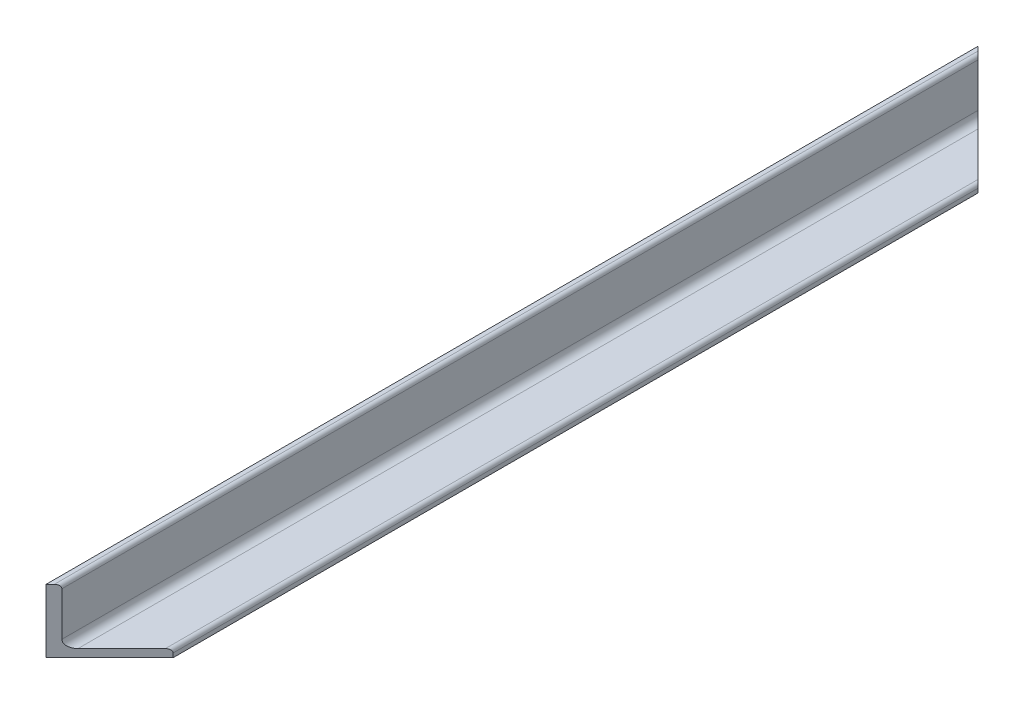
ISO-10303-21;
HEADER;
FILE_DESCRIPTION(('STEP AP214'),'2;1');
FILE_NAME('part.step','',(''),(''),'','','');
FILE_SCHEMA(('AUTOMOTIVE_DESIGN { 1 0 10303 214 1 1 1 1 }'));
ENDSEC;
DATA;
#1=APPLICATION_CONTEXT('core data for automotive mechanical design processes');
#2=APPLICATION_PROTOCOL_DEFINITION('international standard','automotive_design',2000,#1);
#3=PRODUCT_CONTEXT('',#1,'mechanical');
#4=PRODUCT('Part','Part','',(#3));
#5=PRODUCT_RELATED_PRODUCT_CATEGORY('part','',(#4));
#6=PRODUCT_DEFINITION_FORMATION('','',#4);
#7=PRODUCT_DEFINITION_CONTEXT('part definition',#1,'design');
#8=PRODUCT_DEFINITION('design','',#6,#7);
#9=PRODUCT_DEFINITION_SHAPE('','',#8);
#10=(LENGTH_UNIT() NAMED_UNIT(*) SI_UNIT(.MILLI.,.METRE.));
#11=(NAMED_UNIT(*) PLANE_ANGLE_UNIT() SI_UNIT($,.RADIAN.));
#12=(NAMED_UNIT(*) SI_UNIT($,.STERADIAN.) SOLID_ANGLE_UNIT());
#13=UNCERTAINTY_MEASURE_WITH_UNIT(LENGTH_MEASURE(1.E-05),#10,'distance_accuracy_value','');
#14=(GEOMETRIC_REPRESENTATION_CONTEXT(3) GLOBAL_UNCERTAINTY_ASSIGNED_CONTEXT((#13)) GLOBAL_UNIT_ASSIGNED_CONTEXT((#10,
#11,#12)) REPRESENTATION_CONTEXT('',''));
#15=CARTESIAN_POINT('',(0.,0.,0.));
#16=DIRECTION('',(0.,0.,1.));
#17=DIRECTION('',(1.,0.,0.));
#18=AXIS2_PLACEMENT_3D('',#15,#16,#17);
#19=CARTESIAN_POINT('',(279.39999995,0.,279.39999995));
#20=DIRECTION('',(-0.707106781186547,0.,-0.707106781186548));
#21=DIRECTION('',(-0.707106781186548,0.,0.707106781186547));
#22=AXIS2_PLACEMENT_3D('',#19,#20,#21);
#23=PLANE('',#22);
#24=DIRECTION('',(-0.707106781186547,0.,0.707106781186548));
#25=VECTOR('',#24,1.);
#26=CARTESIAN_POINT('',(38.1,0.,520.6999999));
#27=LINE('',#26,#25);
#28=CARTESIAN_POINT('',(38.1,0.,520.6999999));
#29=VERTEX_POINT('',#28);
#30=CARTESIAN_POINT('',(-1.229960707357E-08,0.,558.79999996663));
#31=VERTEX_POINT('',#30);
#32=EDGE_CURVE('E35',#29,#31,#27,.T.);
#33=ORIENTED_EDGE('',*,*,#32,.F.);
#34=DIRECTION('',(0.,-1.,0.));
#35=VECTOR('',#34,1.);
#36=CARTESIAN_POINT('',(38.1,2.47650000000003,520.6999999));
#37=LINE('',#36,#35);
#38=CARTESIAN_POINT('',(38.1,2.47650000000003,520.6999999));
#39=VERTEX_POINT('',#38);
#40=EDGE_CURVE('E135',#39,#29,#37,.T.);
#41=ORIENTED_EDGE('',*,*,#40,.F.);
#42=CARTESIAN_POINT('',(35.814,2.47650000000003,522.9859999));
#43=DIRECTION('',(-0.707106781186547,0.,-0.707106781186548));
#44=DIRECTION('',(-0.707106781186548,0.,0.707106781186547));
#45=AXIS2_PLACEMENT_3D('',#42,#43,#44);
#46=ELLIPSE('',#45,3.23289220358491,2.286);
#47=CARTESIAN_POINT('',(35.814,4.7625,522.9859999));
#48=VERTEX_POINT('',#47);
#49=EDGE_CURVE('E127',#48,#39,#46,.T.);
#50=ORIENTED_EDGE('',*,*,#49,.F.);
#51=DIRECTION('',(0.707106781186548,0.,-0.707106781186547));
#52=VECTOR('',#51,1.);
#53=CARTESIAN_POINT('',(9.58849999999998,4.7625,549.2114999));
#54=LINE('',#53,#52);
#55=CARTESIAN_POINT('',(9.5885,4.7625,549.2114999));
#56=VERTEX_POINT('',#55);
#57=EDGE_CURVE('E130',#56,#48,#54,.T.);
#58=ORIENTED_EDGE('',*,*,#57,.F.);
#59=CARTESIAN_POINT('',(9.5885,9.5885,549.2114999));
#60=DIRECTION('',(0.707106781186548,0.,0.707106781186548));
#61=DIRECTION('',(-0.707106781186548,0.,0.707106781186548));
#62=AXIS2_PLACEMENT_3D('',#59,#60,#61);
#63=ELLIPSE('',#62,6.82499465201256,4.826);
#64=CARTESIAN_POINT('',(4.7625,9.5885,554.0374999));
#65=VERTEX_POINT('',#64);
#66=EDGE_CURVE('E10',#65,#56,#63,.T.);
#67=ORIENTED_EDGE('',*,*,#66,.F.);
#68=DIRECTION('',(0.,-1.,0.));
#69=VECTOR('',#68,1.);
#70=CARTESIAN_POINT('',(4.76250000000002,35.814,554.0374999));
#71=LINE('',#70,#69);
#72=CARTESIAN_POINT('',(4.7625,35.814,554.0374999));
#73=VERTEX_POINT('',#72);
#74=EDGE_CURVE('E98',#73,#65,#71,.T.);
#75=ORIENTED_EDGE('',*,*,#74,.F.);
#76=CARTESIAN_POINT('',(2.4765,35.814,556.3234999));
#77=DIRECTION('',(-0.707106781186547,0.,-0.707106781186548));
#78=DIRECTION('',(-0.707106781186548,0.,0.707106781186547));
#79=AXIS2_PLACEMENT_3D('',#76,#77,#78);
#80=ELLIPSE('',#79,3.23289220358491,2.286);
#81=CARTESIAN_POINT('',(2.4765,38.1,556.3234999));
#82=VERTEX_POINT('',#81);
#83=EDGE_CURVE('E105',#82,#73,#80,.T.);
#84=ORIENTED_EDGE('',*,*,#83,.F.);
#85=DIRECTION('',(0.707106781186533,0.,-0.707106781186562));
#86=VECTOR('',#85,1.);
#87=CARTESIAN_POINT('',(-5.00001319160771E-08,38.1,558.79999995));
#88=LINE('',#87,#86);
#89=CARTESIAN_POINT('',(-1.22996096420541E-08,38.1,558.79999996663));
#90=VERTEX_POINT('',#89);
#91=EDGE_CURVE('E116',#90,#82,#88,.T.);
#92=ORIENTED_EDGE('',*,*,#91,.F.);
#93=DIRECTION('',(0.,1.,0.));
#94=VECTOR('',#93,1.);
#95=CARTESIAN_POINT('',(0.,0.,558.8));
#96=LINE('',#95,#94);
#97=EDGE_CURVE('E119',#31,#90,#96,.T.);
#98=ORIENTED_EDGE('',*,*,#97,.F.);
#99=EDGE_LOOP('',(#33,#41,#50,#58,#67,#75,#84,#92,#98));
#100=FACE_BOUND('',#99,.T.);
#101=ADVANCED_FACE('F16',(#100),#23,.F.);
#102=CARTESIAN_POINT('',(9.5885,9.5885,0.));
#103=DIRECTION('',(0.,0.,1.));
#104=DIRECTION('',(1.,0.,0.));
#105=AXIS2_PLACEMENT_3D('',#102,#103,#104);
#106=CYLINDRICAL_SURFACE('',#105,4.826);
#107=ORIENTED_EDGE('',*,*,#66,.T.);
#108=DIRECTION('',(0.,0.,1.));
#109=VECTOR('',#108,1.);
#110=CARTESIAN_POINT('',(9.5885,4.7625,9.58850010000003));
#111=LINE('',#110,#109);
#112=CARTESIAN_POINT('',(9.5885,4.7625,9.58850010000003));
#113=VERTEX_POINT('',#112);
#114=EDGE_CURVE('E123',#113,#56,#111,.T.);
#115=ORIENTED_EDGE('',*,*,#114,.F.);
#116=CARTESIAN_POINT('',(9.5885,9.5885,9.58850010000003));
#117=DIRECTION('',(0.707106781186548,0.,-0.707106781186548));
#118=DIRECTION('',(-0.707106781186548,0.,-0.707106781186548));
#119=AXIS2_PLACEMENT_3D('',#116,#117,#118);
#120=ELLIPSE('',#119,6.82499465201256,4.826);
#121=CARTESIAN_POINT('',(4.7625,9.5885,4.76250010000003));
#122=VERTEX_POINT('',#121);
#123=EDGE_CURVE('E26',#113,#122,#120,.T.);
#124=ORIENTED_EDGE('',*,*,#123,.T.);
#125=DIRECTION('',(0.,0.,1.));
#126=VECTOR('',#125,1.);
#127=CARTESIAN_POINT('',(4.7625,9.5885,4.76250010000003));
#128=LINE('',#127,#126);
#129=EDGE_CURVE('E94',#122,#65,#128,.T.);
#130=ORIENTED_EDGE('',*,*,#129,.T.);
#131=EDGE_LOOP('',(#107,#115,#124,#130));
#132=FACE_BOUND('',#131,.T.);
#133=ADVANCED_FACE('F158',(#132),#106,.F.);
#134=CARTESIAN_POINT('',(9.5885,4.7625,0.));
#135=DIRECTION('',(0.,1.,0.));
#136=DIRECTION('',(0.,0.,1.));
#137=AXIS2_PLACEMENT_3D('',#134,#135,#136);
#138=PLANE('',#137);
#139=ORIENTED_EDGE('',*,*,#57,.T.);
#140=DIRECTION('',(0.,0.,1.));
#141=VECTOR('',#140,1.);
#142=CARTESIAN_POINT('',(35.814,4.7625,35.8140001));
#143=LINE('',#142,#141);
#144=CARTESIAN_POINT('',(35.814,4.7625,35.8140001));
#145=VERTEX_POINT('',#144);
#146=EDGE_CURVE('E131',#145,#48,#143,.T.);
#147=ORIENTED_EDGE('',*,*,#146,.F.);
#148=DIRECTION('',(-0.707106781186547,0.,-0.707106781186548));
#149=VECTOR('',#148,1.);
#150=CARTESIAN_POINT('',(35.814,4.7625,35.8140001));
#151=LINE('',#150,#149);
#152=EDGE_CURVE('E126',#145,#113,#151,.T.);
#153=ORIENTED_EDGE('',*,*,#152,.T.);
#154=ORIENTED_EDGE('',*,*,#114,.T.);
#155=EDGE_LOOP('',(#139,#147,#153,#154));
#156=FACE_BOUND('',#155,.T.);
#157=ADVANCED_FACE('F161',(#156),#138,.T.);
#158=CARTESIAN_POINT('',(35.814,2.47650000000003,0.));
#159=DIRECTION('',(0.,0.,1.));
#160=DIRECTION('',(1.,0.,0.));
#161=AXIS2_PLACEMENT_3D('',#158,#159,#160);
#162=CYLINDRICAL_SURFACE('',#161,2.286);
#163=ORIENTED_EDGE('',*,*,#49,.T.);
#164=DIRECTION('',(0.,0.,1.));
#165=VECTOR('',#164,1.);
#166=CARTESIAN_POINT('',(38.1,2.47650000000003,38.1000001));
#167=LINE('',#166,#165);
#168=CARTESIAN_POINT('',(38.1,2.47650000000003,38.1000001));
#169=VERTEX_POINT('',#168);
#170=EDGE_CURVE('E138',#169,#39,#167,.T.);
#171=ORIENTED_EDGE('',*,*,#170,.F.);
#172=CARTESIAN_POINT('',(35.814,2.47650000000003,35.8140001));
#173=DIRECTION('',(-0.707106781186548,0.,0.707106781186547));
#174=DIRECTION('',(-0.707106781186547,0.,-0.707106781186548));
#175=AXIS2_PLACEMENT_3D('',#172,#173,#174);
#176=ELLIPSE('',#175,3.23289220358491,2.286);
#177=EDGE_CURVE('E134',#169,#145,#176,.T.);
#178=ORIENTED_EDGE('',*,*,#177,.T.);
#179=ORIENTED_EDGE('',*,*,#146,.T.);
#180=EDGE_LOOP('',(#163,#171,#178,#179));
#181=FACE_BOUND('',#180,.T.);
#182=ADVANCED_FACE('F164',(#181),#162,.T.);
#183=CARTESIAN_POINT('',(38.1,2.47650000000003,0.));
#184=DIRECTION('',(1.,0.,0.));
#185=DIRECTION('',(0.,0.,-1.));
#186=AXIS2_PLACEMENT_3D('',#183,#184,#185);
#187=PLANE('',#186);
#188=ORIENTED_EDGE('',*,*,#40,.T.);
#189=DIRECTION('',(0.,0.,1.));
#190=VECTOR('',#189,1.);
#191=CARTESIAN_POINT('',(38.1,0.,38.1000001));
#192=LINE('',#191,#190);
#193=CARTESIAN_POINT('',(38.1,0.,38.1000001));
#194=VERTEX_POINT('',#193);
#195=EDGE_CURVE('E122',#194,#29,#192,.T.);
#196=ORIENTED_EDGE('',*,*,#195,.F.);
#197=DIRECTION('',(0.,1.,0.));
#198=VECTOR('',#197,1.);
#199=CARTESIAN_POINT('',(38.1,0.,38.1000001));
#200=LINE('',#199,#198);
#201=EDGE_CURVE('E141',#194,#169,#200,.T.);
#202=ORIENTED_EDGE('',*,*,#201,.T.);
#203=ORIENTED_EDGE('',*,*,#170,.T.);
#204=EDGE_LOOP('',(#188,#196,#202,#203));
#205=FACE_BOUND('',#204,.T.);
#206=ADVANCED_FACE('F167',(#205),#187,.T.);
#207=CARTESIAN_POINT('',(-5.00000016E-08,0.,5.00000016E-08));
#208=DIRECTION('',(-0.707106781186548,0.,0.707106781186547));
#209=DIRECTION('',(0.707106781186547,0.,0.707106781186548));
#210=AXIS2_PLACEMENT_3D('',#207,#208,#209);
#211=PLANE('',#210);
#212=ORIENTED_EDGE('',*,*,#152,.F.);
#213=ORIENTED_EDGE('',*,*,#177,.F.);
#214=ORIENTED_EDGE('',*,*,#201,.F.);
#215=DIRECTION('',(0.707106781186547,0.,0.707106781186548));
#216=VECTOR('',#215,1.);
#217=CARTESIAN_POINT('',(-5.00000027102231E-08,0.,5.00000004897769E-08));
#218=LINE('',#217,#216);
#219=CARTESIAN_POINT('',(-1.22995685996788E-08,0.,3.33697700300957E-08));
#220=VERTEX_POINT('',#219);
#221=EDGE_CURVE('E147',#220,#194,#218,.T.);
#222=ORIENTED_EDGE('',*,*,#221,.F.);
#223=DIRECTION('',(0.,1.,0.));
#224=VECTOR('',#223,1.);
#225=CARTESIAN_POINT('',(0.,0.,0.));
#226=LINE('',#225,#224);
#227=CARTESIAN_POINT('',(-1.22995708988027E-08,38.1,3.33697683526881E-08));
#228=VERTEX_POINT('',#227);
#229=EDGE_CURVE('E142',#220,#228,#226,.T.);
#230=ORIENTED_EDGE('',*,*,#229,.T.);
#231=DIRECTION('',(-0.707106781186547,0.,-0.707106781186548));
#232=VECTOR('',#231,1.);
#233=CARTESIAN_POINT('',(2.4765,38.1,2.4765001));
#234=LINE('',#233,#232);
#235=CARTESIAN_POINT('',(2.4765,38.1,2.4765001));
#236=VERTEX_POINT('',#235);
#237=EDGE_CURVE('E103',#236,#228,#234,.T.);
#238=ORIENTED_EDGE('',*,*,#237,.F.);
#239=CARTESIAN_POINT('',(2.4765,35.814,2.4765001));
#240=DIRECTION('',(-0.707106781186548,0.,0.707106781186547));
#241=DIRECTION('',(-0.707106781186547,0.,-0.707106781186548));
#242=AXIS2_PLACEMENT_3D('',#239,#240,#241);
#243=ELLIPSE('',#242,3.23289220358491,2.286);
#244=CARTESIAN_POINT('',(4.7625,35.814,4.7625001));
#245=VERTEX_POINT('',#244);
#246=EDGE_CURVE('E85',#245,#236,#243,.T.);
#247=ORIENTED_EDGE('',*,*,#246,.F.);
#248=DIRECTION('',(0.,1.,0.));
#249=VECTOR('',#248,1.);
#250=CARTESIAN_POINT('',(4.7625,9.5885,4.76250010000003));
#251=LINE('',#250,#249);
#252=EDGE_CURVE('E91',#122,#245,#251,.T.);
#253=ORIENTED_EDGE('',*,*,#252,.F.);
#254=ORIENTED_EDGE('',*,*,#123,.F.);
#255=EDGE_LOOP('',(#212,#213,#214,#222,#230,#238,#247,#253,#254));
#256=FACE_BOUND('',#255,.T.);
#257=ADVANCED_FACE('F101',(#256),#211,.F.);
#258=CARTESIAN_POINT('',(38.1,0.,0.));
#259=DIRECTION('',(0.,-1.,0.));
#260=DIRECTION('',(0.,0.,-1.));
#261=AXIS2_PLACEMENT_3D('',#258,#259,#260);
#262=PLANE('',#261);
#263=ORIENTED_EDGE('',*,*,#32,.T.);
#264=DIRECTION('',(0.,0.,1.));
#265=VECTOR('',#264,1.);
#266=CARTESIAN_POINT('',(0.,0.,0.));
#267=LINE('',#266,#265);
#268=EDGE_CURVE('E118',#220,#31,#267,.T.);
#269=ORIENTED_EDGE('',*,*,#268,.F.);
#270=ORIENTED_EDGE('',*,*,#221,.T.);
#271=ORIENTED_EDGE('',*,*,#195,.T.);
#272=EDGE_LOOP('',(#263,#269,#270,#271));
#273=FACE_BOUND('',#272,.T.);
#274=ADVANCED_FACE('F169',(#273),#262,.T.);
#275=CARTESIAN_POINT('',(0.,0.,0.));
#276=DIRECTION('',(-1.,0.,0.));
#277=DIRECTION('',(0.,0.,1.));
#278=AXIS2_PLACEMENT_3D('',#275,#276,#277);
#279=PLANE('',#278);
#280=ORIENTED_EDGE('',*,*,#97,.T.);
#281=DIRECTION('',(0.,0.,1.));
#282=VECTOR('',#281,1.);
#283=CARTESIAN_POINT('',(0.,38.1,0.));
#284=LINE('',#283,#282);
#285=EDGE_CURVE('E110',#228,#90,#284,.T.);
#286=ORIENTED_EDGE('',*,*,#285,.F.);
#287=ORIENTED_EDGE('',*,*,#229,.F.);
#288=ORIENTED_EDGE('',*,*,#268,.T.);
#289=EDGE_LOOP('',(#280,#286,#287,#288));
#290=FACE_BOUND('',#289,.T.);
#291=ADVANCED_FACE('F174',(#290),#279,.T.);
#292=CARTESIAN_POINT('',(0.,38.1,0.));
#293=DIRECTION('',(0.,1.,0.));
#294=DIRECTION('',(0.,0.,1.));
#295=AXIS2_PLACEMENT_3D('',#292,#293,#294);
#296=PLANE('',#295);
#297=ORIENTED_EDGE('',*,*,#91,.T.);
#298=DIRECTION('',(0.,0.,1.));
#299=VECTOR('',#298,1.);
#300=CARTESIAN_POINT('',(2.4765,38.1,2.4765001));
#301=LINE('',#300,#299);
#302=EDGE_CURVE('E106',#236,#82,#301,.T.);
#303=ORIENTED_EDGE('',*,*,#302,.F.);
#304=ORIENTED_EDGE('',*,*,#237,.T.);
#305=ORIENTED_EDGE('',*,*,#285,.T.);
#306=EDGE_LOOP('',(#297,#303,#304,#305));
#307=FACE_BOUND('',#306,.T.);
#308=ADVANCED_FACE('F176',(#307),#296,.T.);
#309=CARTESIAN_POINT('',(2.4765,35.814,0.));
#310=DIRECTION('',(0.,0.,1.));
#311=DIRECTION('',(1.,0.,0.));
#312=AXIS2_PLACEMENT_3D('',#309,#310,#311);
#313=CYLINDRICAL_SURFACE('',#312,2.286);
#314=ORIENTED_EDGE('',*,*,#83,.T.);
#315=DIRECTION('',(0.,0.,1.));
#316=VECTOR('',#315,1.);
#317=CARTESIAN_POINT('',(4.7625,35.814,4.7625001));
#318=LINE('',#317,#316);
#319=EDGE_CURVE('E20',#245,#73,#318,.T.);
#320=ORIENTED_EDGE('',*,*,#319,.F.);
#321=ORIENTED_EDGE('',*,*,#246,.T.);
#322=ORIENTED_EDGE('',*,*,#302,.T.);
#323=EDGE_LOOP('',(#314,#320,#321,#322));
#324=FACE_BOUND('',#323,.T.);
#325=ADVANCED_FACE('F18',(#324),#313,.T.);
#326=CARTESIAN_POINT('',(4.7625,35.814,0.));
#327=DIRECTION('',(1.,0.,0.));
#328=DIRECTION('',(0.,0.,-1.));
#329=AXIS2_PLACEMENT_3D('',#326,#327,#328);
#330=PLANE('',#329);
#331=ORIENTED_EDGE('',*,*,#74,.T.);
#332=ORIENTED_EDGE('',*,*,#129,.F.);
#333=ORIENTED_EDGE('',*,*,#252,.T.);
#334=ORIENTED_EDGE('',*,*,#319,.T.);
#335=EDGE_LOOP('',(#331,#332,#333,#334));
#336=FACE_BOUND('',#335,.T.);
#337=ADVANCED_FACE('F92',(#336),#330,.T.);
#338=CLOSED_SHELL('',(#101,#133,#157,#182,#206,#257,#274,#291,#308,#325,#337));
#339=MANIFOLD_SOLID_BREP('B1',#338);
#340=ADVANCED_BREP_SHAPE_REPRESENTATION('',(#18,#339),#14);
#341=SHAPE_DEFINITION_REPRESENTATION(#9,#340);
ENDSEC;
END-ISO-10303-21;
